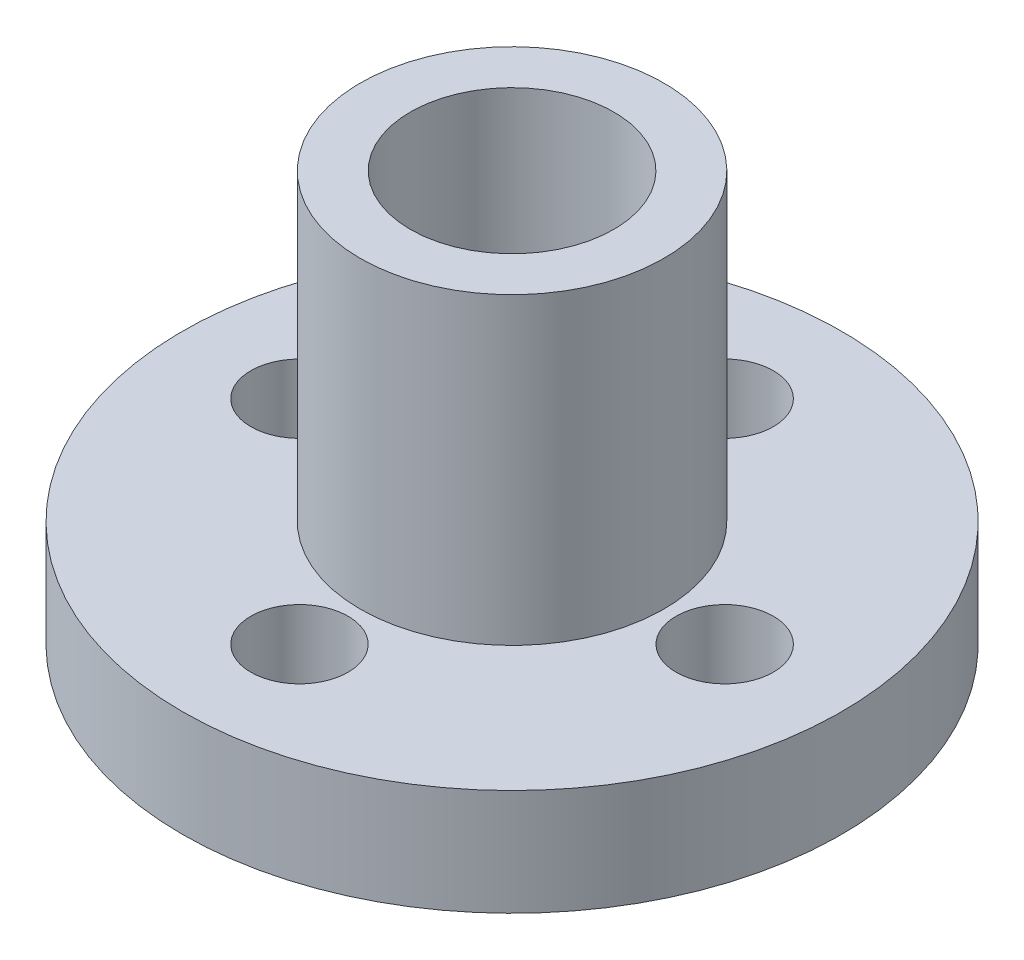
ISO-10303-21;
HEADER;
FILE_DESCRIPTION(('STEP AP214'),'2;1');
FILE_NAME('part.step','',(''),(''),'','','');
FILE_SCHEMA(('AUTOMOTIVE_DESIGN { 1 0 10303 214 1 1 1 1 }'));
ENDSEC;
DATA;
#1=APPLICATION_CONTEXT('core data for automotive mechanical design processes');
#2=APPLICATION_PROTOCOL_DEFINITION('international standard','automotive_design',2000,#1);
#3=PRODUCT_CONTEXT('',#1,'mechanical');
#4=PRODUCT('Part','Part','',(#3));
#5=PRODUCT_RELATED_PRODUCT_CATEGORY('part','',(#4));
#6=PRODUCT_DEFINITION_FORMATION('','',#4);
#7=PRODUCT_DEFINITION_CONTEXT('part definition',#1,'design');
#8=PRODUCT_DEFINITION('design','',#6,#7);
#9=PRODUCT_DEFINITION_SHAPE('','',#8);
#10=(LENGTH_UNIT() NAMED_UNIT(*) SI_UNIT(.MILLI.,.METRE.));
#11=(NAMED_UNIT(*) PLANE_ANGLE_UNIT() SI_UNIT($,.RADIAN.));
#12=(NAMED_UNIT(*) SI_UNIT($,.STERADIAN.) SOLID_ANGLE_UNIT());
#13=UNCERTAINTY_MEASURE_WITH_UNIT(LENGTH_MEASURE(1.E-05),#10,'distance_accuracy_value','');
#14=(GEOMETRIC_REPRESENTATION_CONTEXT(3) GLOBAL_UNCERTAINTY_ASSIGNED_CONTEXT((#13)) GLOBAL_UNIT_ASSIGNED_CONTEXT((#10,
#11,#12)) REPRESENTATION_CONTEXT('',''));
#15=CARTESIAN_POINT('',(0.,0.,0.));
#16=DIRECTION('',(0.,0.,1.));
#17=DIRECTION('',(1.,0.,0.));
#18=AXIS2_PLACEMENT_3D('',#15,#16,#17);
#19=CARTESIAN_POINT('',(0.,0.,0.));
#20=DIRECTION('',(0.,1.,0.));
#21=DIRECTION('',(0.,0.,1.));
#22=AXIS2_PLACEMENT_3D('',#19,#20,#21);
#23=PLANE('',#22);
#24=CARTESIAN_POINT('',(0.,0.,0.));
#25=DIRECTION('',(0.,1.,0.));
#26=DIRECTION('',(0.,0.,1.));
#27=AXIS2_PLACEMENT_3D('',#24,#25,#26);
#28=CIRCLE('',#27,10.85);
#29=CARTESIAN_POINT('',(0.,0.,10.85));
#30=VERTEX_POINT('',#29);
#31=EDGE_CURVE('E45',#30,#30,#28,.T.);
#32=ORIENTED_EDGE('',*,*,#31,.F.);
#33=EDGE_LOOP('',(#32));
#34=FACE_BOUND('',#33,.T.);
#35=CARTESIAN_POINT('',(0.,0.,-7.));
#36=DIRECTION('',(0.,1.,0.));
#37=DIRECTION('',(0.,0.,1.));
#38=AXIS2_PLACEMENT_3D('',#35,#36,#37);
#39=CIRCLE('',#38,1.6);
#40=CARTESIAN_POINT('',(0.,0.,-5.4));
#41=VERTEX_POINT('',#40);
#42=EDGE_CURVE('E67',#41,#41,#39,.T.);
#43=ORIENTED_EDGE('',*,*,#42,.T.);
#44=EDGE_LOOP('',(#43));
#45=FACE_BOUND('',#44,.T.);
#46=CARTESIAN_POINT('',(-7.,0.,0.));
#47=DIRECTION('',(0.,1.,0.));
#48=DIRECTION('',(0.,0.,1.));
#49=AXIS2_PLACEMENT_3D('',#46,#47,#48);
#50=CIRCLE('',#49,1.6);
#51=CARTESIAN_POINT('',(-7.,0.,1.6));
#52=VERTEX_POINT('',#51);
#53=EDGE_CURVE('E73',#52,#52,#50,.T.);
#54=ORIENTED_EDGE('',*,*,#53,.T.);
#55=EDGE_LOOP('',(#54));
#56=FACE_BOUND('',#55,.T.);
#57=CARTESIAN_POINT('',(0.,0.,7.));
#58=DIRECTION('',(0.,1.,0.));
#59=DIRECTION('',(0.,0.,1.));
#60=AXIS2_PLACEMENT_3D('',#57,#58,#59);
#61=CIRCLE('',#60,1.6);
#62=CARTESIAN_POINT('',(0.,0.,8.6));
#63=VERTEX_POINT('',#62);
#64=EDGE_CURVE('E79',#63,#63,#61,.T.);
#65=ORIENTED_EDGE('',*,*,#64,.T.);
#66=EDGE_LOOP('',(#65));
#67=FACE_BOUND('',#66,.T.);
#68=CARTESIAN_POINT('',(7.,0.,0.));
#69=DIRECTION('',(0.,1.,0.));
#70=DIRECTION('',(0.,0.,1.));
#71=AXIS2_PLACEMENT_3D('',#68,#69,#70);
#72=CIRCLE('',#71,1.6);
#73=CARTESIAN_POINT('',(7.,0.,1.6));
#74=VERTEX_POINT('',#73);
#75=EDGE_CURVE('E85',#74,#74,#72,.T.);
#76=ORIENTED_EDGE('',*,*,#75,.T.);
#77=EDGE_LOOP('',(#76));
#78=FACE_BOUND('',#77,.T.);
#79=CARTESIAN_POINT('',(0.,0.,0.));
#80=DIRECTION('',(0.,1.,0.));
#81=DIRECTION('',(0.,0.,1.));
#82=AXIS2_PLACEMENT_3D('',#79,#80,#81);
#83=CIRCLE('',#82,5.);
#84=CARTESIAN_POINT('',(0.,0.,5.));
#85=VERTEX_POINT('',#84);
#86=EDGE_CURVE('E10',#85,#85,#83,.F.);
#87=ORIENTED_EDGE('',*,*,#86,.F.);
#88=EDGE_LOOP('',(#87));
#89=FACE_BOUND('',#88,.T.);
#90=ADVANCED_FACE('F34',(#34,#45,#56,#67,#78,#89),#23,.F.);
#91=CARTESIAN_POINT('',(0.,3.5,0.));
#92=DIRECTION('',(0.,1.,0.));
#93=DIRECTION('',(0.,0.,1.));
#94=AXIS2_PLACEMENT_3D('',#91,#92,#93);
#95=PLANE('',#94);
#96=CARTESIAN_POINT('',(7.,3.5,0.));
#97=DIRECTION('',(0.,1.,0.));
#98=DIRECTION('',(0.,0.,1.));
#99=AXIS2_PLACEMENT_3D('',#96,#97,#98);
#100=CIRCLE('',#99,1.6);
#101=CARTESIAN_POINT('',(7.,3.5,1.6));
#102=VERTEX_POINT('',#101);
#103=EDGE_CURVE('E88',#102,#102,#100,.T.);
#104=ORIENTED_EDGE('',*,*,#103,.F.);
#105=EDGE_LOOP('',(#104));
#106=FACE_BOUND('',#105,.T.);
#107=CARTESIAN_POINT('',(0.,3.5,7.));
#108=DIRECTION('',(0.,1.,0.));
#109=DIRECTION('',(0.,0.,1.));
#110=AXIS2_PLACEMENT_3D('',#107,#108,#109);
#111=CIRCLE('',#110,1.6);
#112=CARTESIAN_POINT('',(0.,3.5,8.6));
#113=VERTEX_POINT('',#112);
#114=EDGE_CURVE('E82',#113,#113,#111,.T.);
#115=ORIENTED_EDGE('',*,*,#114,.F.);
#116=EDGE_LOOP('',(#115));
#117=FACE_BOUND('',#116,.T.);
#118=CARTESIAN_POINT('',(-7.,3.5,0.));
#119=DIRECTION('',(0.,1.,0.));
#120=DIRECTION('',(0.,0.,1.));
#121=AXIS2_PLACEMENT_3D('',#118,#119,#120);
#122=CIRCLE('',#121,1.6);
#123=CARTESIAN_POINT('',(-7.,3.5,1.6));
#124=VERTEX_POINT('',#123);
#125=EDGE_CURVE('E76',#124,#124,#122,.T.);
#126=ORIENTED_EDGE('',*,*,#125,.F.);
#127=EDGE_LOOP('',(#126));
#128=FACE_BOUND('',#127,.T.);
#129=CARTESIAN_POINT('',(0.,3.5,-7.));
#130=DIRECTION('',(0.,1.,0.));
#131=DIRECTION('',(0.,0.,1.));
#132=AXIS2_PLACEMENT_3D('',#129,#130,#131);
#133=CIRCLE('',#132,1.6);
#134=CARTESIAN_POINT('',(0.,3.5,-5.4));
#135=VERTEX_POINT('',#134);
#136=EDGE_CURVE('E70',#135,#135,#133,.T.);
#137=ORIENTED_EDGE('',*,*,#136,.F.);
#138=EDGE_LOOP('',(#137));
#139=FACE_BOUND('',#138,.T.);
#140=CARTESIAN_POINT('',(0.,3.5,0.));
#141=DIRECTION('',(0.,1.,0.));
#142=DIRECTION('',(0.,0.,1.));
#143=AXIS2_PLACEMENT_3D('',#140,#141,#142);
#144=CIRCLE('',#143,10.85);
#145=CARTESIAN_POINT('',(0.,3.5,10.85));
#146=VERTEX_POINT('',#145);
#147=EDGE_CURVE('E41',#146,#146,#144,.T.);
#148=ORIENTED_EDGE('',*,*,#147,.T.);
#149=EDGE_LOOP('',(#148));
#150=FACE_BOUND('',#149,.T.);
#151=CARTESIAN_POINT('',(0.,3.5,0.));
#152=DIRECTION('',(0.,1.,0.));
#153=DIRECTION('',(0.,0.,1.));
#154=AXIS2_PLACEMENT_3D('',#151,#152,#153);
#155=CIRCLE('',#154,5.);
#156=CARTESIAN_POINT('',(0.,3.5,5.));
#157=VERTEX_POINT('',#156);
#158=EDGE_CURVE('E58',#157,#157,#155,.T.);
#159=ORIENTED_EDGE('',*,*,#158,.F.);
#160=EDGE_LOOP('',(#159));
#161=FACE_BOUND('',#160,.T.);
#162=ADVANCED_FACE('F124',(#106,#117,#128,#139,#150,#161),#95,.T.);
#163=CARTESIAN_POINT('',(0.,3.5,0.));
#164=DIRECTION('',(0.,-1.,0.));
#165=DIRECTION('',(0.,0.,-1.));
#166=AXIS2_PLACEMENT_3D('',#163,#164,#165);
#167=CYLINDRICAL_SURFACE('',#166,10.85);
#168=ORIENTED_EDGE('',*,*,#147,.F.);
#169=EDGE_LOOP('',(#168));
#170=FACE_BOUND('',#169,.T.);
#171=ORIENTED_EDGE('',*,*,#31,.T.);
#172=EDGE_LOOP('',(#171));
#173=FACE_BOUND('',#172,.T.);
#174=ADVANCED_FACE('F36',(#170,#173),#167,.T.);
#175=CARTESIAN_POINT('',(0.,3.5,0.));
#176=DIRECTION('',(0.,-1.,0.));
#177=DIRECTION('',(0.,0.,-1.));
#178=AXIS2_PLACEMENT_3D('',#175,#176,#177);
#179=CYLINDRICAL_SURFACE('',#178,3.4);
#180=CARTESIAN_POINT('',(0.,3.5,0.));
#181=DIRECTION('',(0.,1.,0.));
#182=DIRECTION('',(0.,0.,1.));
#183=AXIS2_PLACEMENT_3D('',#180,#181,#182);
#184=CIRCLE('',#183,3.4);
#185=CARTESIAN_POINT('',(0.,3.5,3.4));
#186=VERTEX_POINT('',#185);
#187=EDGE_CURVE('E54',#186,#186,#184,.T.);
#188=ORIENTED_EDGE('',*,*,#187,.T.);
#189=EDGE_LOOP('',(#188));
#190=FACE_BOUND('',#189,.T.);
#191=CARTESIAN_POINT('',(0.,0.,0.));
#192=DIRECTION('',(0.,1.,0.));
#193=DIRECTION('',(0.,0.,1.));
#194=AXIS2_PLACEMENT_3D('',#191,#192,#193);
#195=CIRCLE('',#194,3.4);
#196=CARTESIAN_POINT('',(0.,0.,3.4));
#197=VERTEX_POINT('',#196);
#198=EDGE_CURVE('E50',#197,#197,#195,.T.);
#199=ORIENTED_EDGE('',*,*,#198,.F.);
#200=EDGE_LOOP('',(#199));
#201=FACE_BOUND('',#200,.T.);
#202=ADVANCED_FACE('F134',(#190,#201),#179,.F.);
#203=CARTESIAN_POINT('',(0.,13.5,0.));
#204=DIRECTION('',(0.,1.,0.));
#205=DIRECTION('',(0.,0.,1.));
#206=AXIS2_PLACEMENT_3D('',#203,#204,#205);
#207=PLANE('',#206);
#208=CARTESIAN_POINT('',(0.,13.5,0.));
#209=DIRECTION('',(0.,1.,0.));
#210=DIRECTION('',(0.,0.,1.));
#211=AXIS2_PLACEMENT_3D('',#208,#209,#210);
#212=CIRCLE('',#211,5.);
#213=CARTESIAN_POINT('',(0.,13.5,5.));
#214=VERTEX_POINT('',#213);
#215=EDGE_CURVE('E57',#214,#214,#212,.T.);
#216=ORIENTED_EDGE('',*,*,#215,.T.);
#217=EDGE_LOOP('',(#216));
#218=FACE_BOUND('',#217,.T.);
#219=CARTESIAN_POINT('',(0.,13.5,0.));
#220=DIRECTION('',(0.,1.,0.));
#221=DIRECTION('',(0.,0.,1.));
#222=AXIS2_PLACEMENT_3D('',#219,#220,#221);
#223=CIRCLE('',#222,3.35);
#224=CARTESIAN_POINT('',(0.,13.5,3.35));
#225=VERTEX_POINT('',#224);
#226=EDGE_CURVE('E61',#225,#225,#223,.T.);
#227=ORIENTED_EDGE('',*,*,#226,.F.);
#228=EDGE_LOOP('',(#227));
#229=FACE_BOUND('',#228,.T.);
#230=ADVANCED_FACE('F137',(#218,#229),#207,.T.);
#231=CARTESIAN_POINT('',(0.,3.5,0.));
#232=DIRECTION('',(0.,1.,0.));
#233=DIRECTION('',(0.,0.,1.));
#234=AXIS2_PLACEMENT_3D('',#231,#232,#233);
#235=PLANE('',#234);
#236=ORIENTED_EDGE('',*,*,#187,.F.);
#237=EDGE_LOOP('',(#236));
#238=FACE_BOUND('',#237,.T.);
#239=CARTESIAN_POINT('',(0.,3.5,0.));
#240=DIRECTION('',(0.,1.,0.));
#241=DIRECTION('',(0.,0.,1.));
#242=AXIS2_PLACEMENT_3D('',#239,#240,#241);
#243=CIRCLE('',#242,3.35);
#244=CARTESIAN_POINT('',(0.,3.5,3.35));
#245=VERTEX_POINT('',#244);
#246=EDGE_CURVE('E64',#245,#245,#243,.T.);
#247=ORIENTED_EDGE('',*,*,#246,.T.);
#248=EDGE_LOOP('',(#247));
#249=FACE_BOUND('',#248,.T.);
#250=ADVANCED_FACE('F143',(#238,#249),#235,.F.);
#251=CARTESIAN_POINT('',(0.,13.5,0.));
#252=DIRECTION('',(0.,-1.,0.));
#253=DIRECTION('',(0.,0.,-1.));
#254=AXIS2_PLACEMENT_3D('',#251,#252,#253);
#255=CYLINDRICAL_SURFACE('',#254,5.);
#256=ORIENTED_EDGE('',*,*,#215,.F.);
#257=EDGE_LOOP('',(#256));
#258=FACE_BOUND('',#257,.T.);
#259=ORIENTED_EDGE('',*,*,#158,.T.);
#260=EDGE_LOOP('',(#259));
#261=FACE_BOUND('',#260,.T.);
#262=ADVANCED_FACE('F139',(#258,#261),#255,.T.);
#263=CARTESIAN_POINT('',(0.,13.5,0.));
#264=DIRECTION('',(0.,-1.,0.));
#265=DIRECTION('',(0.,0.,-1.));
#266=AXIS2_PLACEMENT_3D('',#263,#264,#265);
#267=CYLINDRICAL_SURFACE('',#266,3.35);
#268=ORIENTED_EDGE('',*,*,#226,.T.);
#269=EDGE_LOOP('',(#268));
#270=FACE_BOUND('',#269,.T.);
#271=ORIENTED_EDGE('',*,*,#246,.F.);
#272=EDGE_LOOP('',(#271));
#273=FACE_BOUND('',#272,.T.);
#274=ADVANCED_FACE('F142',(#270,#273),#267,.F.);
#275=CARTESIAN_POINT('',(0.,0.,-7.));
#276=DIRECTION('',(0.,1.,0.));
#277=DIRECTION('',(0.,0.,1.));
#278=AXIS2_PLACEMENT_3D('',#275,#276,#277);
#279=CYLINDRICAL_SURFACE('',#278,1.6);
#280=ORIENTED_EDGE('',*,*,#42,.F.);
#281=EDGE_LOOP('',(#280));
#282=FACE_BOUND('',#281,.T.);
#283=ORIENTED_EDGE('',*,*,#136,.T.);
#284=EDGE_LOOP('',(#283));
#285=FACE_BOUND('',#284,.T.);
#286=ADVANCED_FACE('F153',(#282,#285),#279,.F.);
#287=CARTESIAN_POINT('',(-7.,0.,0.));
#288=DIRECTION('',(0.,1.,0.));
#289=DIRECTION('',(0.,0.,1.));
#290=AXIS2_PLACEMENT_3D('',#287,#288,#289);
#291=CYLINDRICAL_SURFACE('',#290,1.6);
#292=ORIENTED_EDGE('',*,*,#53,.F.);
#293=EDGE_LOOP('',(#292));
#294=FACE_BOUND('',#293,.T.);
#295=ORIENTED_EDGE('',*,*,#125,.T.);
#296=EDGE_LOOP('',(#295));
#297=FACE_BOUND('',#296,.T.);
#298=ADVANCED_FACE('F157',(#294,#297),#291,.F.);
#299=CARTESIAN_POINT('',(0.,0.,7.));
#300=DIRECTION('',(0.,1.,0.));
#301=DIRECTION('',(0.,0.,1.));
#302=AXIS2_PLACEMENT_3D('',#299,#300,#301);
#303=CYLINDRICAL_SURFACE('',#302,1.6);
#304=ORIENTED_EDGE('',*,*,#64,.F.);
#305=EDGE_LOOP('',(#304));
#306=FACE_BOUND('',#305,.T.);
#307=ORIENTED_EDGE('',*,*,#114,.T.);
#308=EDGE_LOOP('',(#307));
#309=FACE_BOUND('',#308,.T.);
#310=ADVANCED_FACE('F119',(#306,#309),#303,.F.);
#311=CARTESIAN_POINT('',(7.,0.,0.));
#312=DIRECTION('',(0.,1.,0.));
#313=DIRECTION('',(0.,0.,1.));
#314=AXIS2_PLACEMENT_3D('',#311,#312,#313);
#315=CYLINDRICAL_SURFACE('',#314,1.6);
#316=ORIENTED_EDGE('',*,*,#75,.F.);
#317=EDGE_LOOP('',(#316));
#318=FACE_BOUND('',#317,.T.);
#319=ORIENTED_EDGE('',*,*,#103,.T.);
#320=EDGE_LOOP('',(#319));
#321=FACE_BOUND('',#320,.T.);
#322=ADVANCED_FACE('F109',(#318,#321),#315,.F.);
#323=CARTESIAN_POINT('',(0.,-1.5,0.));
#324=DIRECTION('',(0.,-1.,0.));
#325=DIRECTION('',(0.,0.,-1.));
#326=AXIS2_PLACEMENT_3D('',#323,#324,#325);
#327=PLANE('',#326);
#328=CARTESIAN_POINT('',(0.,-1.5,0.));
#329=DIRECTION('',(0.,-1.,0.));
#330=DIRECTION('',(0.,0.,-1.));
#331=AXIS2_PLACEMENT_3D('',#328,#329,#330);
#332=CIRCLE('',#331,5.);
#333=CARTESIAN_POINT('',(0.,-1.5,-5.));
#334=VERTEX_POINT('',#333);
#335=EDGE_CURVE('E91',#334,#334,#332,.T.);
#336=ORIENTED_EDGE('',*,*,#335,.T.);
#337=EDGE_LOOP('',(#336));
#338=FACE_BOUND('',#337,.T.);
#339=CARTESIAN_POINT('',(0.,-1.5,0.));
#340=DIRECTION('',(0.,-1.,0.));
#341=DIRECTION('',(0.,0.,-1.));
#342=AXIS2_PLACEMENT_3D('',#339,#340,#341);
#343=CIRCLE('',#342,3.35);
#344=CARTESIAN_POINT('',(0.,-1.5,-3.35));
#345=VERTEX_POINT('',#344);
#346=EDGE_CURVE('E96',#345,#345,#343,.T.);
#347=ORIENTED_EDGE('',*,*,#346,.F.);
#348=EDGE_LOOP('',(#347));
#349=FACE_BOUND('',#348,.T.);
#350=ADVANCED_FACE('F106',(#338,#349),#327,.T.);
#351=CARTESIAN_POINT('',(0.,0.,0.));
#352=DIRECTION('',(0.,-1.,0.));
#353=DIRECTION('',(0.,0.,-1.));
#354=AXIS2_PLACEMENT_3D('',#351,#352,#353);
#355=PLANE('',#354);
#356=ORIENTED_EDGE('',*,*,#198,.T.);
#357=EDGE_LOOP('',(#356));
#358=FACE_BOUND('',#357,.T.);
#359=CARTESIAN_POINT('',(0.,0.,0.));
#360=DIRECTION('',(0.,-1.,0.));
#361=DIRECTION('',(0.,0.,-1.));
#362=AXIS2_PLACEMENT_3D('',#359,#360,#361);
#363=CIRCLE('',#362,3.35);
#364=CARTESIAN_POINT('',(0.,0.,-3.35));
#365=VERTEX_POINT('',#364);
#366=EDGE_CURVE('E97',#365,#365,#363,.T.);
#367=ORIENTED_EDGE('',*,*,#366,.T.);
#368=EDGE_LOOP('',(#367));
#369=FACE_BOUND('',#368,.T.);
#370=ADVANCED_FACE('F108',(#358,#369),#355,.F.);
#371=CARTESIAN_POINT('',(0.,-1.5,0.));
#372=DIRECTION('',(0.,1.,0.));
#373=DIRECTION('',(0.,0.,1.));
#374=AXIS2_PLACEMENT_3D('',#371,#372,#373);
#375=CYLINDRICAL_SURFACE('',#374,5.);
#376=ORIENTED_EDGE('',*,*,#335,.F.);
#377=EDGE_LOOP('',(#376));
#378=FACE_BOUND('',#377,.T.);
#379=ORIENTED_EDGE('',*,*,#86,.T.);
#380=EDGE_LOOP('',(#379));
#381=FACE_BOUND('',#380,.T.);
#382=ADVANCED_FACE('F116',(#378,#381),#375,.T.);
#383=CARTESIAN_POINT('',(0.,-1.5,0.));
#384=DIRECTION('',(0.,1.,0.));
#385=DIRECTION('',(0.,0.,1.));
#386=AXIS2_PLACEMENT_3D('',#383,#384,#385);
#387=CYLINDRICAL_SURFACE('',#386,3.35);
#388=ORIENTED_EDGE('',*,*,#346,.T.);
#389=EDGE_LOOP('',(#388));
#390=FACE_BOUND('',#389,.T.);
#391=ORIENTED_EDGE('',*,*,#366,.F.);
#392=EDGE_LOOP('',(#391));
#393=FACE_BOUND('',#392,.T.);
#394=ADVANCED_FACE('F103',(#390,#393),#387,.F.);
#395=CLOSED_SHELL('',(#90,#162,#174,#202,#230,#250,#262,#274,#286,#298,#310,#322,#350,#370,#382,#394));
#396=MANIFOLD_SOLID_BREP('B2',#395);
#397=ADVANCED_BREP_SHAPE_REPRESENTATION('',(#18,#396),#14);
#398=SHAPE_DEFINITION_REPRESENTATION(#9,#397);
ENDSEC;
END-ISO-10303-21;
